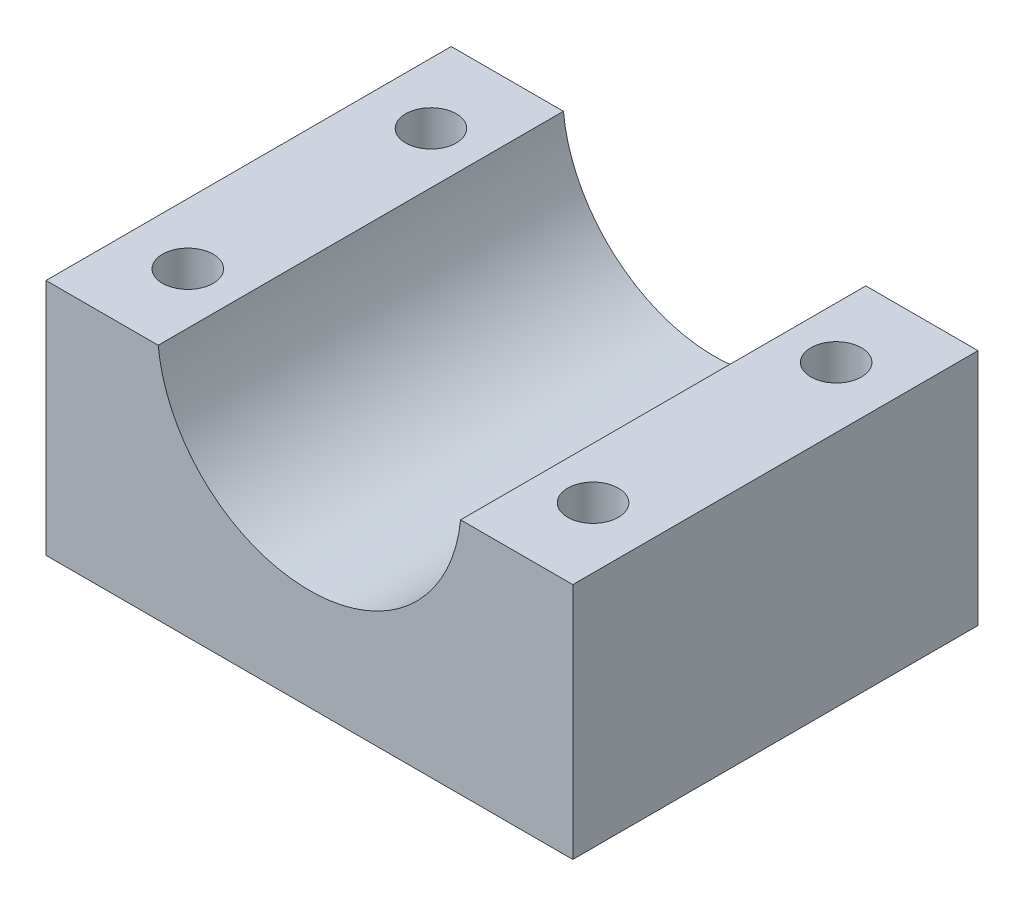
ISO-10303-21;
HEADER;
FILE_DESCRIPTION(('STEP AP214'),'2;1');
FILE_NAME('part.step','',(''),(''),'','','');
FILE_SCHEMA(('AUTOMOTIVE_DESIGN { 1 0 10303 214 1 1 1 1 }'));
ENDSEC;
DATA;
#1=APPLICATION_CONTEXT('core data for automotive mechanical design processes');
#2=APPLICATION_PROTOCOL_DEFINITION('international standard','automotive_design',2000,#1);
#3=PRODUCT_CONTEXT('',#1,'mechanical');
#4=PRODUCT('Part','Part','',(#3));
#5=PRODUCT_RELATED_PRODUCT_CATEGORY('part','',(#4));
#6=PRODUCT_DEFINITION_FORMATION('','',#4);
#7=PRODUCT_DEFINITION_CONTEXT('part definition',#1,'design');
#8=PRODUCT_DEFINITION('design','',#6,#7);
#9=PRODUCT_DEFINITION_SHAPE('','',#8);
#10=(LENGTH_UNIT() NAMED_UNIT(*) SI_UNIT(.MILLI.,.METRE.));
#11=(NAMED_UNIT(*) PLANE_ANGLE_UNIT() SI_UNIT($,.RADIAN.));
#12=(NAMED_UNIT(*) SI_UNIT($,.STERADIAN.) SOLID_ANGLE_UNIT());
#13=UNCERTAINTY_MEASURE_WITH_UNIT(LENGTH_MEASURE(1.E-05),#10,'distance_accuracy_value','');
#14=(GEOMETRIC_REPRESENTATION_CONTEXT(3) GLOBAL_UNCERTAINTY_ASSIGNED_CONTEXT((#13)) GLOBAL_UNIT_ASSIGNED_CONTEXT((#10,
#11,#12)) REPRESENTATION_CONTEXT('',''));
#15=CARTESIAN_POINT('',(0.,0.,0.));
#16=DIRECTION('',(0.,0.,1.));
#17=DIRECTION('',(1.,0.,0.));
#18=AXIS2_PLACEMENT_3D('',#15,#16,#17);
#19=CARTESIAN_POINT('',(26.,25.,40.));
#20=DIRECTION('',(0.,0.,-1.));
#21=DIRECTION('',(-1.,0.,0.));
#22=AXIS2_PLACEMENT_3D('',#19,#20,#21);
#23=CYLINDRICAL_SURFACE('',#22,15.);
#24=CARTESIAN_POINT('',(26.,25.,0.));
#25=DIRECTION('',(0.,0.,1.));
#26=DIRECTION('',(1.,0.,0.));
#27=AXIS2_PLACEMENT_3D('',#24,#25,#26);
#28=CIRCLE('',#27,15.);
#29=CARTESIAN_POINT('',(11.0751884434007,23.5,0.));
#30=VERTEX_POINT('',#29);
#31=CARTESIAN_POINT('',(40.9248115565993,23.5,0.));
#32=VERTEX_POINT('',#31);
#33=EDGE_CURVE('E117',#30,#32,#28,.T.);
#34=ORIENTED_EDGE('',*,*,#33,.F.);
#35=DIRECTION('',(0.,0.,-1.));
#36=VECTOR('',#35,1.);
#37=CARTESIAN_POINT('',(11.0751884434007,23.5,40.));
#38=LINE('',#37,#36);
#39=CARTESIAN_POINT('',(11.0751884434007,23.5,40.));
#40=VERTEX_POINT('',#39);
#41=EDGE_CURVE('E11',#40,#30,#38,.T.);
#42=ORIENTED_EDGE('',*,*,#41,.F.);
#43=CARTESIAN_POINT('',(26.,25.,40.));
#44=DIRECTION('',(0.,0.,1.));
#45=DIRECTION('',(1.,0.,0.));
#46=AXIS2_PLACEMENT_3D('',#43,#44,#45);
#47=CIRCLE('',#46,15.);
#48=CARTESIAN_POINT('',(40.9248115565993,23.5,40.));
#49=VERTEX_POINT('',#48);
#50=EDGE_CURVE('E142',#40,#49,#47,.T.);
#51=ORIENTED_EDGE('',*,*,#50,.T.);
#52=DIRECTION('',(0.,0.,-1.));
#53=VECTOR('',#52,1.);
#54=CARTESIAN_POINT('',(40.9248115565993,23.5,40.));
#55=LINE('',#54,#53);
#56=EDGE_CURVE('E51',#49,#32,#55,.T.);
#57=ORIENTED_EDGE('',*,*,#56,.T.);
#58=EDGE_LOOP('',(#34,#42,#51,#57));
#59=FACE_BOUND('',#58,.T.);
#60=ADVANCED_FACE('F35',(#59),#23,.F.);
#61=CARTESIAN_POINT('',(0.,23.5,40.));
#62=DIRECTION('',(0.,1.,0.));
#63=DIRECTION('',(0.,0.,1.));
#64=AXIS2_PLACEMENT_3D('',#61,#62,#63);
#65=PLANE('',#64);
#66=CARTESIAN_POINT('',(6.,23.5,32.));
#67=DIRECTION('',(0.,1.,0.));
#68=DIRECTION('',(0.,0.,1.));
#69=AXIS2_PLACEMENT_3D('',#66,#67,#68);
#70=CIRCLE('',#69,2.5);
#71=CARTESIAN_POINT('',(6.,23.5,29.5));
#72=VERTEX_POINT('',#71);
#73=EDGE_CURVE('E150',#72,#72,#70,.F.);
#74=ORIENTED_EDGE('',*,*,#73,.T.);
#75=EDGE_LOOP('',(#74));
#76=FACE_BOUND('',#75,.T.);
#77=CARTESIAN_POINT('',(6.,23.5,8.));
#78=DIRECTION('',(0.,1.,0.));
#79=DIRECTION('',(0.,0.,1.));
#80=AXIS2_PLACEMENT_3D('',#77,#78,#79);
#81=CIRCLE('',#80,2.5);
#82=CARTESIAN_POINT('',(6.,23.5,5.5));
#83=VERTEX_POINT('',#82);
#84=EDGE_CURVE('E120',#83,#83,#81,.F.);
#85=ORIENTED_EDGE('',*,*,#84,.T.);
#86=EDGE_LOOP('',(#85));
#87=FACE_BOUND('',#86,.T.);
#88=DIRECTION('',(1.,0.,0.));
#89=VECTOR('',#88,1.);
#90=CARTESIAN_POINT('',(0.,23.5,0.));
#91=LINE('',#90,#89);
#92=CARTESIAN_POINT('',(0.,23.5,0.));
#93=VERTEX_POINT('',#92);
#94=EDGE_CURVE('E119',#93,#30,#91,.T.);
#95=ORIENTED_EDGE('',*,*,#94,.F.);
#96=DIRECTION('',(0.,0.,-1.));
#97=VECTOR('',#96,1.);
#98=CARTESIAN_POINT('',(0.,23.5,40.));
#99=LINE('',#98,#97);
#100=CARTESIAN_POINT('',(0.,23.5,40.));
#101=VERTEX_POINT('',#100);
#102=EDGE_CURVE('E43',#101,#93,#99,.T.);
#103=ORIENTED_EDGE('',*,*,#102,.F.);
#104=DIRECTION('',(1.,0.,0.));
#105=VECTOR('',#104,1.);
#106=CARTESIAN_POINT('',(0.,23.5,40.));
#107=LINE('',#106,#105);
#108=EDGE_CURVE('E114',#101,#40,#107,.T.);
#109=ORIENTED_EDGE('',*,*,#108,.T.);
#110=ORIENTED_EDGE('',*,*,#41,.T.);
#111=EDGE_LOOP('',(#95,#103,#109,#110));
#112=FACE_BOUND('',#111,.T.);
#113=ADVANCED_FACE('F138',(#76,#87,#112),#65,.T.);
#114=CARTESIAN_POINT('',(0.,0.,40.));
#115=DIRECTION('',(-1.,0.,0.));
#116=DIRECTION('',(0.,0.,1.));
#117=AXIS2_PLACEMENT_3D('',#114,#115,#116);
#118=PLANE('',#117);
#119=DIRECTION('',(0.,1.,0.));
#120=VECTOR('',#119,1.);
#121=CARTESIAN_POINT('',(0.,0.,0.));
#122=LINE('',#121,#120);
#123=CARTESIAN_POINT('',(0.,0.,0.));
#124=VERTEX_POINT('',#123);
#125=EDGE_CURVE('E123',#124,#93,#122,.T.);
#126=ORIENTED_EDGE('',*,*,#125,.F.);
#127=DIRECTION('',(0.,0.,-1.));
#128=VECTOR('',#127,1.);
#129=CARTESIAN_POINT('',(0.,0.,40.));
#130=LINE('',#129,#128);
#131=CARTESIAN_POINT('',(0.,0.,40.));
#132=VERTEX_POINT('',#131);
#133=EDGE_CURVE('E108',#132,#124,#130,.T.);
#134=ORIENTED_EDGE('',*,*,#133,.F.);
#135=DIRECTION('',(0.,1.,0.));
#136=VECTOR('',#135,1.);
#137=CARTESIAN_POINT('',(0.,0.,40.));
#138=LINE('',#137,#136);
#139=EDGE_CURVE('E98',#132,#101,#138,.T.);
#140=ORIENTED_EDGE('',*,*,#139,.T.);
#141=ORIENTED_EDGE('',*,*,#102,.T.);
#142=EDGE_LOOP('',(#126,#134,#140,#141));
#143=FACE_BOUND('',#142,.T.);
#144=ADVANCED_FACE('F135',(#143),#118,.T.);
#145=CARTESIAN_POINT('',(0.,0.,40.));
#146=DIRECTION('',(0.,1.,0.));
#147=DIRECTION('',(0.,0.,1.));
#148=AXIS2_PLACEMENT_3D('',#145,#146,#147);
#149=PLANE('',#148);
#150=CARTESIAN_POINT('',(46.,0.,8.));
#151=DIRECTION('',(0.,-1.,0.));
#152=DIRECTION('',(0.,0.,-1.));
#153=AXIS2_PLACEMENT_3D('',#150,#151,#152);
#154=CIRCLE('',#153,2.5);
#155=CARTESIAN_POINT('',(46.,0.,5.5));
#156=VERTEX_POINT('',#155);
#157=EDGE_CURVE('E165',#156,#156,#154,.T.);
#158=ORIENTED_EDGE('',*,*,#157,.F.);
#159=EDGE_LOOP('',(#158));
#160=FACE_BOUND('',#159,.T.);
#161=CARTESIAN_POINT('',(46.,0.,32.));
#162=DIRECTION('',(0.,-1.,0.));
#163=DIRECTION('',(0.,0.,-1.));
#164=AXIS2_PLACEMENT_3D('',#161,#162,#163);
#165=CIRCLE('',#164,2.5);
#166=CARTESIAN_POINT('',(46.,0.,29.5));
#167=VERTEX_POINT('',#166);
#168=EDGE_CURVE('E159',#167,#167,#165,.T.);
#169=ORIENTED_EDGE('',*,*,#168,.F.);
#170=EDGE_LOOP('',(#169));
#171=FACE_BOUND('',#170,.T.);
#172=CARTESIAN_POINT('',(6.,0.,32.));
#173=DIRECTION('',(0.,-1.,0.));
#174=DIRECTION('',(0.,0.,-1.));
#175=AXIS2_PLACEMENT_3D('',#172,#173,#174);
#176=CIRCLE('',#175,2.5);
#177=CARTESIAN_POINT('',(6.,0.,29.5));
#178=VERTEX_POINT('',#177);
#179=EDGE_CURVE('E153',#178,#178,#176,.T.);
#180=ORIENTED_EDGE('',*,*,#179,.F.);
#181=EDGE_LOOP('',(#180));
#182=FACE_BOUND('',#181,.T.);
#183=CARTESIAN_POINT('',(6.,0.,8.));
#184=DIRECTION('',(0.,-1.,0.));
#185=DIRECTION('',(0.,0.,-1.));
#186=AXIS2_PLACEMENT_3D('',#183,#184,#185);
#187=CIRCLE('',#186,2.5);
#188=CARTESIAN_POINT('',(6.,0.,5.5));
#189=VERTEX_POINT('',#188);
#190=EDGE_CURVE('E147',#189,#189,#187,.T.);
#191=ORIENTED_EDGE('',*,*,#190,.F.);
#192=EDGE_LOOP('',(#191));
#193=FACE_BOUND('',#192,.T.);
#194=DIRECTION('',(1.,0.,0.));
#195=VECTOR('',#194,1.);
#196=CARTESIAN_POINT('',(0.,0.,0.));
#197=LINE('',#196,#195);
#198=CARTESIAN_POINT('',(52.,0.,0.));
#199=VERTEX_POINT('',#198);
#200=EDGE_CURVE('E105',#124,#199,#197,.T.);
#201=ORIENTED_EDGE('',*,*,#200,.T.);
#202=DIRECTION('',(0.,0.,-1.));
#203=VECTOR('',#202,1.);
#204=CARTESIAN_POINT('',(52.,0.,40.));
#205=LINE('',#204,#203);
#206=CARTESIAN_POINT('',(52.,0.,40.));
#207=VERTEX_POINT('',#206);
#208=EDGE_CURVE('E102',#207,#199,#205,.T.);
#209=ORIENTED_EDGE('',*,*,#208,.F.);
#210=DIRECTION('',(1.,0.,0.));
#211=VECTOR('',#210,1.);
#212=CARTESIAN_POINT('',(0.,0.,40.));
#213=LINE('',#212,#211);
#214=EDGE_CURVE('E90',#132,#207,#213,.T.);
#215=ORIENTED_EDGE('',*,*,#214,.F.);
#216=ORIENTED_EDGE('',*,*,#133,.T.);
#217=EDGE_LOOP('',(#201,#209,#215,#216));
#218=FACE_BOUND('',#217,.T.);
#219=ADVANCED_FACE('F103',(#160,#171,#182,#193,#218),#149,.F.);
#220=CARTESIAN_POINT('',(52.,0.,40.));
#221=DIRECTION('',(-1.,0.,0.));
#222=DIRECTION('',(0.,0.,1.));
#223=AXIS2_PLACEMENT_3D('',#220,#221,#222);
#224=PLANE('',#223);
#225=DIRECTION('',(0.,1.,0.));
#226=VECTOR('',#225,1.);
#227=CARTESIAN_POINT('',(52.,0.,0.));
#228=LINE('',#227,#226);
#229=CARTESIAN_POINT('',(52.,23.5,0.));
#230=VERTEX_POINT('',#229);
#231=EDGE_CURVE('E128',#199,#230,#228,.T.);
#232=ORIENTED_EDGE('',*,*,#231,.T.);
#233=DIRECTION('',(0.,0.,-1.));
#234=VECTOR('',#233,1.);
#235=CARTESIAN_POINT('',(52.,23.5,40.));
#236=LINE('',#235,#234);
#237=CARTESIAN_POINT('',(52.,23.5,40.));
#238=VERTEX_POINT('',#237);
#239=EDGE_CURVE('E71',#238,#230,#236,.T.);
#240=ORIENTED_EDGE('',*,*,#239,.F.);
#241=DIRECTION('',(0.,1.,0.));
#242=VECTOR('',#241,1.);
#243=CARTESIAN_POINT('',(52.,0.,40.));
#244=LINE('',#243,#242);
#245=EDGE_CURVE('E95',#207,#238,#244,.T.);
#246=ORIENTED_EDGE('',*,*,#245,.F.);
#247=ORIENTED_EDGE('',*,*,#208,.T.);
#248=EDGE_LOOP('',(#232,#240,#246,#247));
#249=FACE_BOUND('',#248,.T.);
#250=ADVANCED_FACE('F110',(#249),#224,.F.);
#251=CARTESIAN_POINT('',(46.,23.5,8.));
#252=DIRECTION('',(0.,1.,0.));
#253=DIRECTION('',(0.,0.,1.));
#254=AXIS2_PLACEMENT_3D('',#251,#252,#253);
#255=CIRCLE('',#254,2.5);
#256=CARTESIAN_POINT('',(46.,23.5,5.5));
#257=VERTEX_POINT('',#256);
#258=EDGE_CURVE('E162',#257,#257,#255,.F.);
#259=ORIENTED_EDGE('',*,*,#258,.T.);
#260=EDGE_LOOP('',(#259));
#261=FACE_BOUND('',#260,.T.);
#262=CARTESIAN_POINT('',(46.,23.5,32.));
#263=DIRECTION('',(0.,1.,0.));
#264=DIRECTION('',(0.,0.,1.));
#265=AXIS2_PLACEMENT_3D('',#262,#263,#264);
#266=CIRCLE('',#265,2.5);
#267=CARTESIAN_POINT('',(46.,23.5,29.5));
#268=VERTEX_POINT('',#267);
#269=EDGE_CURVE('E156',#268,#268,#266,.F.);
#270=ORIENTED_EDGE('',*,*,#269,.T.);
#271=EDGE_LOOP('',(#270));
#272=FACE_BOUND('',#271,.T.);
#273=EDGE_CURVE('E124',#32,#230,#91,.T.);
#274=ORIENTED_EDGE('',*,*,#273,.F.);
#275=ORIENTED_EDGE('',*,*,#56,.F.);
#276=EDGE_CURVE('E111',#49,#238,#107,.T.);
#277=ORIENTED_EDGE('',*,*,#276,.T.);
#278=ORIENTED_EDGE('',*,*,#239,.T.);
#279=EDGE_LOOP('',(#274,#275,#277,#278));
#280=FACE_BOUND('',#279,.T.);
#281=ADVANCED_FACE('F191',(#261,#272,#280),#65,.T.);
#282=CARTESIAN_POINT('',(0.,0.,40.));
#283=DIRECTION('',(0.,0.,1.));
#284=DIRECTION('',(1.,0.,0.));
#285=AXIS2_PLACEMENT_3D('',#282,#283,#284);
#286=PLANE('',#285);
#287=ORIENTED_EDGE('',*,*,#50,.F.);
#288=ORIENTED_EDGE('',*,*,#108,.F.);
#289=ORIENTED_EDGE('',*,*,#139,.F.);
#290=ORIENTED_EDGE('',*,*,#214,.T.);
#291=ORIENTED_EDGE('',*,*,#245,.T.);
#292=ORIENTED_EDGE('',*,*,#276,.F.);
#293=EDGE_LOOP('',(#287,#288,#289,#290,#291,#292));
#294=FACE_BOUND('',#293,.T.);
#295=ADVANCED_FACE('F92',(#294),#286,.T.);
#296=CARTESIAN_POINT('',(0.,0.,0.));
#297=DIRECTION('',(0.,0.,1.));
#298=DIRECTION('',(1.,0.,0.));
#299=AXIS2_PLACEMENT_3D('',#296,#297,#298);
#300=PLANE('',#299);
#301=ORIENTED_EDGE('',*,*,#33,.T.);
#302=ORIENTED_EDGE('',*,*,#273,.T.);
#303=ORIENTED_EDGE('',*,*,#231,.F.);
#304=ORIENTED_EDGE('',*,*,#200,.F.);
#305=ORIENTED_EDGE('',*,*,#125,.T.);
#306=ORIENTED_EDGE('',*,*,#94,.T.);
#307=EDGE_LOOP('',(#301,#302,#303,#304,#305,#306));
#308=FACE_BOUND('',#307,.T.);
#309=ADVANCED_FACE('F140',(#308),#300,.F.);
#310=CARTESIAN_POINT('',(6.,30.5710678118655,8.));
#311=DIRECTION('',(0.,-1.,0.));
#312=DIRECTION('',(0.,0.,-1.));
#313=AXIS2_PLACEMENT_3D('',#310,#311,#312);
#314=CYLINDRICAL_SURFACE('',#313,2.5);
#315=CARTESIAN_POINT('',(6.,0.,5.5));
#316=CARTESIAN_POINT('',(6.,0.24479166666667,5.5));
#317=CARTESIAN_POINT('',(6.,0.489583333333336,5.5));
#318=CARTESIAN_POINT('',(6.,0.97916666666667,5.5));
#319=CARTESIAN_POINT('',(6.,1.22395833333334,5.5));
#320=CARTESIAN_POINT('',(6.,1.71354166666667,5.5));
#321=CARTESIAN_POINT('',(6.,1.95833333333334,5.5));
#322=CARTESIAN_POINT('',(6.,2.44791666666667,5.5));
#323=CARTESIAN_POINT('',(6.,2.69270833333334,5.5));
#324=CARTESIAN_POINT('',(6.,3.18229166666667,5.5));
#325=CARTESIAN_POINT('',(6.,3.42708333333334,5.5));
#326=CARTESIAN_POINT('',(6.,3.91666666666667,5.5));
#327=CARTESIAN_POINT('',(6.,4.16145833333334,5.5));
#328=CARTESIAN_POINT('',(6.,4.65104166666667,5.5));
#329=CARTESIAN_POINT('',(6.,4.89583333333334,5.5));
#330=CARTESIAN_POINT('',(6.,5.38541666666667,5.5));
#331=CARTESIAN_POINT('',(6.,5.63020833333333,5.5));
#332=CARTESIAN_POINT('',(6.,6.11979166666667,5.5));
#333=CARTESIAN_POINT('',(6.,6.36458333333334,5.5));
#334=CARTESIAN_POINT('',(6.,6.85416666666667,5.5));
#335=CARTESIAN_POINT('',(6.,7.09895833333334,5.5));
#336=CARTESIAN_POINT('',(6.,7.58854166666667,5.5));
#337=CARTESIAN_POINT('',(6.,7.83333333333334,5.5));
#338=CARTESIAN_POINT('',(6.,8.32291666666667,5.5));
#339=CARTESIAN_POINT('',(6.,8.56770833333334,5.5));
#340=CARTESIAN_POINT('',(6.,9.05729166666667,5.5));
#341=CARTESIAN_POINT('',(6.,9.30208333333333,5.5));
#342=CARTESIAN_POINT('',(6.,9.79166666666667,5.5));
#343=CARTESIAN_POINT('',(6.,10.0364583333333,5.5));
#344=CARTESIAN_POINT('',(6.,10.5260416666667,5.5));
#345=CARTESIAN_POINT('',(6.,10.7708333333333,5.5));
#346=CARTESIAN_POINT('',(6.,11.2604166666667,5.5));
#347=CARTESIAN_POINT('',(6.,11.5052083333333,5.5));
#348=CARTESIAN_POINT('',(6.,11.9947916666667,5.5));
#349=CARTESIAN_POINT('',(6.,12.2395833333333,5.5));
#350=CARTESIAN_POINT('',(6.,12.7291666666667,5.5));
#351=CARTESIAN_POINT('',(6.,12.9739583333333,5.5));
#352=CARTESIAN_POINT('',(6.,13.4635416666667,5.5));
#353=CARTESIAN_POINT('',(6.,13.7083333333333,5.5));
#354=CARTESIAN_POINT('',(6.,14.1979166666667,5.5));
#355=CARTESIAN_POINT('',(6.,14.4427083333333,5.5));
#356=CARTESIAN_POINT('',(6.,14.9322916666667,5.5));
#357=CARTESIAN_POINT('',(6.,15.1770833333333,5.5));
#358=CARTESIAN_POINT('',(6.,15.6666666666667,5.5));
#359=CARTESIAN_POINT('',(6.,15.9114583333333,5.5));
#360=CARTESIAN_POINT('',(6.,16.4010416666667,5.5));
#361=CARTESIAN_POINT('',(6.,16.6458333333333,5.5));
#362=CARTESIAN_POINT('',(6.,17.1354166666667,5.5));
#363=CARTESIAN_POINT('',(6.,17.3802083333333,5.5));
#364=CARTESIAN_POINT('',(6.,17.8697916666667,5.5));
#365=CARTESIAN_POINT('',(6.,18.1145833333333,5.5));
#366=CARTESIAN_POINT('',(6.,18.6041666666667,5.5));
#367=CARTESIAN_POINT('',(6.,18.8489583333333,5.5));
#368=CARTESIAN_POINT('',(6.,19.3385416666667,5.5));
#369=CARTESIAN_POINT('',(6.,19.5833333333333,5.5));
#370=CARTESIAN_POINT('',(6.,20.0729166666667,5.5));
#371=CARTESIAN_POINT('',(6.,20.3177083333333,5.5));
#372=CARTESIAN_POINT('',(6.,20.8072916666667,5.5));
#373=CARTESIAN_POINT('',(6.,21.0520833333333,5.5));
#374=CARTESIAN_POINT('',(6.,21.5416666666667,5.5));
#375=CARTESIAN_POINT('',(6.,21.7864583333333,5.5));
#376=CARTESIAN_POINT('',(6.,22.2760416666667,5.5));
#377=CARTESIAN_POINT('',(6.,22.5208333333333,5.5));
#378=CARTESIAN_POINT('',(6.,23.0104166666667,5.5));
#379=CARTESIAN_POINT('',(6.,23.2552083333333,5.5));
#380=CARTESIAN_POINT('',(6.,23.5,5.5));
#381=B_SPLINE_CURVE_WITH_KNOTS('',3,(#315,#316,#317,#318,#319,#320,#321,#322,#323,#324,#325,
#326,#327,#328,#329,#330,#331,#332,#333,#334,#335,#336,#337,#338,#339,#340,#341,#342,#343,#344,
#345,#346,#347,#348,#349,#350,#351,#352,#353,#354,#355,#356,#357,#358,#359,#360,#361,#362,#363,
#364,#365,#366,#367,#368,#369,#370,#371,#372,#373,#374,#375,#376,#377,#378,#379,#380),
.UNSPECIFIED.,.F.,.F.,(4,2,2,2,2,2,2,2,2,2,2,2,2,2,2,2,2,2,2,2,2,2,2,2,2,2,2,2,2,2,2,2,4),(0.,
0.734374999999999,1.46875,2.203125,2.9375,3.671875,4.40625,5.140625,5.875,6.609375,7.34375,
8.078125,8.8125,9.546875,10.28125,11.015625,11.75,12.484375,13.21875,13.953125,14.6875,
15.421875,16.15625,16.890625,17.625,18.359375,19.09375,19.828125,20.5625,21.296875,22.03125,
22.765625,23.5),.UNSPECIFIED.);
#382=EDGE_CURVE('BSEAM181',#189,#83,#381,.T.);
#383=ORIENTED_EDGE('',*,*,#190,.T.);
#384=ORIENTED_EDGE('',*,*,#84,.F.);
#385=ORIENTED_EDGE('',*,*,#382,.T.);
#386=ORIENTED_EDGE('',*,*,#382,.F.);
#387=EDGE_LOOP('',(#383,#385,#384,#386));
#388=FACE_BOUND('',#387,.T.);
#389=ADVANCED_FACE('F181',(#388),#314,.F.);
#390=CARTESIAN_POINT('',(6.,30.5710678118655,32.));
#391=DIRECTION('',(0.,-1.,0.));
#392=DIRECTION('',(0.,0.,-1.));
#393=AXIS2_PLACEMENT_3D('',#390,#391,#392);
#394=CYLINDRICAL_SURFACE('',#393,2.5);
#395=CARTESIAN_POINT('',(6.,0.,29.5));
#396=CARTESIAN_POINT('',(6.,0.24479166666667,29.5));
#397=CARTESIAN_POINT('',(6.,0.489583333333336,29.5));
#398=CARTESIAN_POINT('',(6.,0.97916666666667,29.5));
#399=CARTESIAN_POINT('',(6.,1.22395833333334,29.5));
#400=CARTESIAN_POINT('',(6.,1.71354166666667,29.5));
#401=CARTESIAN_POINT('',(6.,1.95833333333334,29.5));
#402=CARTESIAN_POINT('',(6.,2.44791666666667,29.5));
#403=CARTESIAN_POINT('',(6.,2.69270833333334,29.5));
#404=CARTESIAN_POINT('',(6.,3.18229166666667,29.5));
#405=CARTESIAN_POINT('',(6.,3.42708333333334,29.5));
#406=CARTESIAN_POINT('',(6.,3.91666666666667,29.5));
#407=CARTESIAN_POINT('',(6.,4.16145833333334,29.5));
#408=CARTESIAN_POINT('',(6.,4.65104166666667,29.5));
#409=CARTESIAN_POINT('',(6.,4.89583333333334,29.5));
#410=CARTESIAN_POINT('',(6.,5.38541666666667,29.5));
#411=CARTESIAN_POINT('',(6.,5.63020833333333,29.5));
#412=CARTESIAN_POINT('',(6.,6.11979166666667,29.5));
#413=CARTESIAN_POINT('',(6.,6.36458333333334,29.5));
#414=CARTESIAN_POINT('',(6.,6.85416666666667,29.5));
#415=CARTESIAN_POINT('',(6.,7.09895833333334,29.5));
#416=CARTESIAN_POINT('',(6.,7.58854166666667,29.5));
#417=CARTESIAN_POINT('',(6.,7.83333333333334,29.5));
#418=CARTESIAN_POINT('',(6.,8.32291666666667,29.5));
#419=CARTESIAN_POINT('',(6.,8.56770833333334,29.5));
#420=CARTESIAN_POINT('',(6.,9.05729166666667,29.5));
#421=CARTESIAN_POINT('',(6.,9.30208333333333,29.5));
#422=CARTESIAN_POINT('',(6.,9.79166666666667,29.5));
#423=CARTESIAN_POINT('',(6.,10.0364583333333,29.5));
#424=CARTESIAN_POINT('',(6.,10.5260416666667,29.5));
#425=CARTESIAN_POINT('',(6.,10.7708333333333,29.5));
#426=CARTESIAN_POINT('',(6.,11.2604166666667,29.5));
#427=CARTESIAN_POINT('',(6.,11.5052083333333,29.5));
#428=CARTESIAN_POINT('',(6.,11.9947916666667,29.5));
#429=CARTESIAN_POINT('',(6.,12.2395833333333,29.5));
#430=CARTESIAN_POINT('',(6.,12.7291666666667,29.5));
#431=CARTESIAN_POINT('',(6.,12.9739583333333,29.5));
#432=CARTESIAN_POINT('',(6.,13.4635416666667,29.5));
#433=CARTESIAN_POINT('',(6.,13.7083333333333,29.5));
#434=CARTESIAN_POINT('',(6.,14.1979166666667,29.5));
#435=CARTESIAN_POINT('',(6.,14.4427083333333,29.5));
#436=CARTESIAN_POINT('',(6.,14.9322916666667,29.5));
#437=CARTESIAN_POINT('',(6.,15.1770833333333,29.5));
#438=CARTESIAN_POINT('',(6.,15.6666666666667,29.5));
#439=CARTESIAN_POINT('',(6.,15.9114583333333,29.5));
#440=CARTESIAN_POINT('',(6.,16.4010416666667,29.5));
#441=CARTESIAN_POINT('',(6.,16.6458333333333,29.5));
#442=CARTESIAN_POINT('',(6.,17.1354166666667,29.5));
#443=CARTESIAN_POINT('',(6.,17.3802083333333,29.5));
#444=CARTESIAN_POINT('',(6.,17.8697916666667,29.5));
#445=CARTESIAN_POINT('',(6.,18.1145833333333,29.5));
#446=CARTESIAN_POINT('',(6.,18.6041666666667,29.5));
#447=CARTESIAN_POINT('',(6.,18.8489583333333,29.5));
#448=CARTESIAN_POINT('',(6.,19.3385416666667,29.5));
#449=CARTESIAN_POINT('',(6.,19.5833333333333,29.5));
#450=CARTESIAN_POINT('',(6.,20.0729166666667,29.5));
#451=CARTESIAN_POINT('',(6.,20.3177083333333,29.5));
#452=CARTESIAN_POINT('',(6.,20.8072916666667,29.5));
#453=CARTESIAN_POINT('',(6.,21.0520833333333,29.5));
#454=CARTESIAN_POINT('',(6.,21.5416666666667,29.5));
#455=CARTESIAN_POINT('',(6.,21.7864583333333,29.5));
#456=CARTESIAN_POINT('',(6.,22.2760416666667,29.5));
#457=CARTESIAN_POINT('',(6.,22.5208333333333,29.5));
#458=CARTESIAN_POINT('',(6.,23.0104166666667,29.5));
#459=CARTESIAN_POINT('',(6.,23.2552083333333,29.5));
#460=CARTESIAN_POINT('',(6.,23.5,29.5));
#461=B_SPLINE_CURVE_WITH_KNOTS('',3,(#395,#396,#397,#398,#399,#400,#401,#402,#403,#404,#405,
#406,#407,#408,#409,#410,#411,#412,#413,#414,#415,#416,#417,#418,#419,#420,#421,#422,#423,#424,
#425,#426,#427,#428,#429,#430,#431,#432,#433,#434,#435,#436,#437,#438,#439,#440,#441,#442,#443,
#444,#445,#446,#447,#448,#449,#450,#451,#452,#453,#454,#455,#456,#457,#458,#459,#460),
.UNSPECIFIED.,.F.,.F.,(4,2,2,2,2,2,2,2,2,2,2,2,2,2,2,2,2,2,2,2,2,2,2,2,2,2,2,2,2,2,2,2,4),(0.,
0.734374999999999,1.46875,2.203125,2.9375,3.671875,4.40625,5.140625,5.875,6.609375,7.34375,
8.078125,8.8125,9.546875,10.28125,11.015625,11.75,12.484375,13.21875,13.953125,14.6875,
15.421875,16.15625,16.890625,17.625,18.359375,19.09375,19.828125,20.5625,21.296875,22.03125,
22.765625,23.5),.UNSPECIFIED.);
#462=EDGE_CURVE('BSEAM184',#178,#72,#461,.T.);
#463=ORIENTED_EDGE('',*,*,#179,.T.);
#464=ORIENTED_EDGE('',*,*,#73,.F.);
#465=ORIENTED_EDGE('',*,*,#462,.T.);
#466=ORIENTED_EDGE('',*,*,#462,.F.);
#467=EDGE_LOOP('',(#463,#465,#464,#466));
#468=FACE_BOUND('',#467,.T.);
#469=ADVANCED_FACE('F184',(#468),#394,.F.);
#470=CARTESIAN_POINT('',(46.,30.5710678118655,32.));
#471=DIRECTION('',(0.,-1.,0.));
#472=DIRECTION('',(0.,0.,-1.));
#473=AXIS2_PLACEMENT_3D('',#470,#471,#472);
#474=CYLINDRICAL_SURFACE('',#473,2.5);
#475=CARTESIAN_POINT('',(46.,0.,29.5));
#476=CARTESIAN_POINT('',(46.,0.24479166666667,29.5));
#477=CARTESIAN_POINT('',(46.,0.489583333333336,29.5));
#478=CARTESIAN_POINT('',(46.,0.97916666666667,29.5));
#479=CARTESIAN_POINT('',(46.,1.22395833333334,29.5));
#480=CARTESIAN_POINT('',(46.,1.71354166666667,29.5));
#481=CARTESIAN_POINT('',(46.,1.95833333333334,29.5));
#482=CARTESIAN_POINT('',(46.,2.44791666666667,29.5));
#483=CARTESIAN_POINT('',(46.,2.69270833333334,29.5));
#484=CARTESIAN_POINT('',(46.,3.18229166666667,29.5));
#485=CARTESIAN_POINT('',(46.,3.42708333333334,29.5));
#486=CARTESIAN_POINT('',(46.,3.91666666666667,29.5));
#487=CARTESIAN_POINT('',(46.,4.16145833333334,29.5));
#488=CARTESIAN_POINT('',(46.,4.65104166666667,29.5));
#489=CARTESIAN_POINT('',(46.,4.89583333333334,29.5));
#490=CARTESIAN_POINT('',(46.,5.38541666666667,29.5));
#491=CARTESIAN_POINT('',(46.,5.63020833333333,29.5));
#492=CARTESIAN_POINT('',(46.,6.11979166666667,29.5));
#493=CARTESIAN_POINT('',(46.,6.36458333333334,29.5));
#494=CARTESIAN_POINT('',(46.,6.85416666666667,29.5));
#495=CARTESIAN_POINT('',(46.,7.09895833333334,29.5));
#496=CARTESIAN_POINT('',(46.,7.58854166666667,29.5));
#497=CARTESIAN_POINT('',(46.,7.83333333333334,29.5));
#498=CARTESIAN_POINT('',(46.,8.32291666666667,29.5));
#499=CARTESIAN_POINT('',(46.,8.56770833333334,29.5));
#500=CARTESIAN_POINT('',(46.,9.05729166666667,29.5));
#501=CARTESIAN_POINT('',(46.,9.30208333333333,29.5));
#502=CARTESIAN_POINT('',(46.,9.79166666666667,29.5));
#503=CARTESIAN_POINT('',(46.,10.0364583333333,29.5));
#504=CARTESIAN_POINT('',(46.,10.5260416666667,29.5));
#505=CARTESIAN_POINT('',(46.,10.7708333333333,29.5));
#506=CARTESIAN_POINT('',(46.,11.2604166666667,29.5));
#507=CARTESIAN_POINT('',(46.,11.5052083333333,29.5));
#508=CARTESIAN_POINT('',(46.,11.9947916666667,29.5));
#509=CARTESIAN_POINT('',(46.,12.2395833333333,29.5));
#510=CARTESIAN_POINT('',(46.,12.7291666666667,29.5));
#511=CARTESIAN_POINT('',(46.,12.9739583333333,29.5));
#512=CARTESIAN_POINT('',(46.,13.4635416666667,29.5));
#513=CARTESIAN_POINT('',(46.,13.7083333333333,29.5));
#514=CARTESIAN_POINT('',(46.,14.1979166666667,29.5));
#515=CARTESIAN_POINT('',(46.,14.4427083333333,29.5));
#516=CARTESIAN_POINT('',(46.,14.9322916666667,29.5));
#517=CARTESIAN_POINT('',(46.,15.1770833333333,29.5));
#518=CARTESIAN_POINT('',(46.,15.6666666666667,29.5));
#519=CARTESIAN_POINT('',(46.,15.9114583333333,29.5));
#520=CARTESIAN_POINT('',(46.,16.4010416666667,29.5));
#521=CARTESIAN_POINT('',(46.,16.6458333333333,29.5));
#522=CARTESIAN_POINT('',(46.,17.1354166666667,29.5));
#523=CARTESIAN_POINT('',(46.,17.3802083333333,29.5));
#524=CARTESIAN_POINT('',(46.,17.8697916666667,29.5));
#525=CARTESIAN_POINT('',(46.,18.1145833333333,29.5));
#526=CARTESIAN_POINT('',(46.,18.6041666666667,29.5));
#527=CARTESIAN_POINT('',(46.,18.8489583333333,29.5));
#528=CARTESIAN_POINT('',(46.,19.3385416666667,29.5));
#529=CARTESIAN_POINT('',(46.,19.5833333333333,29.5));
#530=CARTESIAN_POINT('',(46.,20.0729166666667,29.5));
#531=CARTESIAN_POINT('',(46.,20.3177083333333,29.5));
#532=CARTESIAN_POINT('',(46.,20.8072916666667,29.5));
#533=CARTESIAN_POINT('',(46.,21.0520833333333,29.5));
#534=CARTESIAN_POINT('',(46.,21.5416666666667,29.5));
#535=CARTESIAN_POINT('',(46.,21.7864583333333,29.5));
#536=CARTESIAN_POINT('',(46.,22.2760416666667,29.5));
#537=CARTESIAN_POINT('',(46.,22.5208333333333,29.5));
#538=CARTESIAN_POINT('',(46.,23.0104166666667,29.5));
#539=CARTESIAN_POINT('',(46.,23.2552083333333,29.5));
#540=CARTESIAN_POINT('',(46.,23.5,29.5));
#541=B_SPLINE_CURVE_WITH_KNOTS('',3,(#475,#476,#477,#478,#479,#480,#481,#482,#483,#484,#485,
#486,#487,#488,#489,#490,#491,#492,#493,#494,#495,#496,#497,#498,#499,#500,#501,#502,#503,#504,
#505,#506,#507,#508,#509,#510,#511,#512,#513,#514,#515,#516,#517,#518,#519,#520,#521,#522,#523,
#524,#525,#526,#527,#528,#529,#530,#531,#532,#533,#534,#535,#536,#537,#538,#539,#540),
.UNSPECIFIED.,.F.,.F.,(4,2,2,2,2,2,2,2,2,2,2,2,2,2,2,2,2,2,2,2,2,2,2,2,2,2,2,2,2,2,2,2,4),(0.,
0.734374999999999,1.46875,2.203125,2.9375,3.671875,4.40625,5.140625,5.875,6.609375,7.34375,
8.078125,8.8125,9.546875,10.28125,11.015625,11.75,12.484375,13.21875,13.953125,14.6875,
15.421875,16.15625,16.890625,17.625,18.359375,19.09375,19.828125,20.5625,21.296875,22.03125,
22.765625,23.5),.UNSPECIFIED.);
#542=EDGE_CURVE('BSEAM209',#167,#268,#541,.T.);
#543=ORIENTED_EDGE('',*,*,#168,.T.);
#544=ORIENTED_EDGE('',*,*,#269,.F.);
#545=ORIENTED_EDGE('',*,*,#542,.T.);
#546=ORIENTED_EDGE('',*,*,#542,.F.);
#547=EDGE_LOOP('',(#543,#545,#544,#546));
#548=FACE_BOUND('',#547,.T.);
#549=ADVANCED_FACE('F209',(#548),#474,.F.);
#550=CARTESIAN_POINT('',(46.,30.5710678118655,8.));
#551=DIRECTION('',(0.,-1.,0.));
#552=DIRECTION('',(0.,0.,-1.));
#553=AXIS2_PLACEMENT_3D('',#550,#551,#552);
#554=CYLINDRICAL_SURFACE('',#553,2.5);
#555=CARTESIAN_POINT('',(46.,0.,5.5));
#556=CARTESIAN_POINT('',(46.,0.24479166666667,5.5));
#557=CARTESIAN_POINT('',(46.,0.489583333333336,5.5));
#558=CARTESIAN_POINT('',(46.,0.97916666666667,5.5));
#559=CARTESIAN_POINT('',(46.,1.22395833333334,5.5));
#560=CARTESIAN_POINT('',(46.,1.71354166666667,5.5));
#561=CARTESIAN_POINT('',(46.,1.95833333333334,5.5));
#562=CARTESIAN_POINT('',(46.,2.44791666666667,5.5));
#563=CARTESIAN_POINT('',(46.,2.69270833333334,5.5));
#564=CARTESIAN_POINT('',(46.,3.18229166666667,5.5));
#565=CARTESIAN_POINT('',(46.,3.42708333333334,5.5));
#566=CARTESIAN_POINT('',(46.,3.91666666666667,5.5));
#567=CARTESIAN_POINT('',(46.,4.16145833333334,5.5));
#568=CARTESIAN_POINT('',(46.,4.65104166666667,5.5));
#569=CARTESIAN_POINT('',(46.,4.89583333333334,5.5));
#570=CARTESIAN_POINT('',(46.,5.38541666666667,5.5));
#571=CARTESIAN_POINT('',(46.,5.63020833333333,5.5));
#572=CARTESIAN_POINT('',(46.,6.11979166666667,5.5));
#573=CARTESIAN_POINT('',(46.,6.36458333333334,5.5));
#574=CARTESIAN_POINT('',(46.,6.85416666666667,5.5));
#575=CARTESIAN_POINT('',(46.,7.09895833333334,5.5));
#576=CARTESIAN_POINT('',(46.,7.58854166666667,5.5));
#577=CARTESIAN_POINT('',(46.,7.83333333333334,5.5));
#578=CARTESIAN_POINT('',(46.,8.32291666666667,5.5));
#579=CARTESIAN_POINT('',(46.,8.56770833333334,5.5));
#580=CARTESIAN_POINT('',(46.,9.05729166666667,5.5));
#581=CARTESIAN_POINT('',(46.,9.30208333333333,5.5));
#582=CARTESIAN_POINT('',(46.,9.79166666666667,5.5));
#583=CARTESIAN_POINT('',(46.,10.0364583333333,5.5));
#584=CARTESIAN_POINT('',(46.,10.5260416666667,5.5));
#585=CARTESIAN_POINT('',(46.,10.7708333333333,5.5));
#586=CARTESIAN_POINT('',(46.,11.2604166666667,5.5));
#587=CARTESIAN_POINT('',(46.,11.5052083333333,5.5));
#588=CARTESIAN_POINT('',(46.,11.9947916666667,5.5));
#589=CARTESIAN_POINT('',(46.,12.2395833333333,5.5));
#590=CARTESIAN_POINT('',(46.,12.7291666666667,5.5));
#591=CARTESIAN_POINT('',(46.,12.9739583333333,5.5));
#592=CARTESIAN_POINT('',(46.,13.4635416666667,5.5));
#593=CARTESIAN_POINT('',(46.,13.7083333333333,5.5));
#594=CARTESIAN_POINT('',(46.,14.1979166666667,5.5));
#595=CARTESIAN_POINT('',(46.,14.4427083333333,5.5));
#596=CARTESIAN_POINT('',(46.,14.9322916666667,5.5));
#597=CARTESIAN_POINT('',(46.,15.1770833333333,5.5));
#598=CARTESIAN_POINT('',(46.,15.6666666666667,5.5));
#599=CARTESIAN_POINT('',(46.,15.9114583333333,5.5));
#600=CARTESIAN_POINT('',(46.,16.4010416666667,5.5));
#601=CARTESIAN_POINT('',(46.,16.6458333333333,5.5));
#602=CARTESIAN_POINT('',(46.,17.1354166666667,5.5));
#603=CARTESIAN_POINT('',(46.,17.3802083333333,5.5));
#604=CARTESIAN_POINT('',(46.,17.8697916666667,5.5));
#605=CARTESIAN_POINT('',(46.,18.1145833333333,5.5));
#606=CARTESIAN_POINT('',(46.,18.6041666666667,5.5));
#607=CARTESIAN_POINT('',(46.,18.8489583333333,5.5));
#608=CARTESIAN_POINT('',(46.,19.3385416666667,5.5));
#609=CARTESIAN_POINT('',(46.,19.5833333333333,5.5));
#610=CARTESIAN_POINT('',(46.,20.0729166666667,5.5));
#611=CARTESIAN_POINT('',(46.,20.3177083333333,5.5));
#612=CARTESIAN_POINT('',(46.,20.8072916666667,5.5));
#613=CARTESIAN_POINT('',(46.,21.0520833333333,5.5));
#614=CARTESIAN_POINT('',(46.,21.5416666666667,5.5));
#615=CARTESIAN_POINT('',(46.,21.7864583333333,5.5));
#616=CARTESIAN_POINT('',(46.,22.2760416666667,5.5));
#617=CARTESIAN_POINT('',(46.,22.5208333333333,5.5));
#618=CARTESIAN_POINT('',(46.,23.0104166666667,5.5));
#619=CARTESIAN_POINT('',(46.,23.2552083333333,5.5));
#620=CARTESIAN_POINT('',(46.,23.5,5.5));
#621=B_SPLINE_CURVE_WITH_KNOTS('',3,(#555,#556,#557,#558,#559,#560,#561,#562,#563,#564,#565,
#566,#567,#568,#569,#570,#571,#572,#573,#574,#575,#576,#577,#578,#579,#580,#581,#582,#583,#584,
#585,#586,#587,#588,#589,#590,#591,#592,#593,#594,#595,#596,#597,#598,#599,#600,#601,#602,#603,
#604,#605,#606,#607,#608,#609,#610,#611,#612,#613,#614,#615,#616,#617,#618,#619,#620),
.UNSPECIFIED.,.F.,.F.,(4,2,2,2,2,2,2,2,2,2,2,2,2,2,2,2,2,2,2,2,2,2,2,2,2,2,2,2,2,2,2,2,4),(0.,
0.734374999999999,1.46875,2.203125,2.9375,3.671875,4.40625,5.140625,5.875,6.609375,7.34375,
8.078125,8.8125,9.546875,10.28125,11.015625,11.75,12.484375,13.21875,13.953125,14.6875,
15.421875,16.15625,16.890625,17.625,18.359375,19.09375,19.828125,20.5625,21.296875,22.03125,
22.765625,23.5),.UNSPECIFIED.);
#622=EDGE_CURVE('BSEAM169',#156,#257,#621,.T.);
#623=ORIENTED_EDGE('',*,*,#157,.T.);
#624=ORIENTED_EDGE('',*,*,#258,.F.);
#625=ORIENTED_EDGE('',*,*,#622,.T.);
#626=ORIENTED_EDGE('',*,*,#622,.F.);
#627=EDGE_LOOP('',(#623,#625,#624,#626));
#628=FACE_BOUND('',#627,.T.);
#629=ADVANCED_FACE('F169',(#628),#554,.F.);
#630=CLOSED_SHELL('',(#60,#113,#144,#219,#250,#281,#295,#309,#389,#469,#549,#629));
#631=MANIFOLD_SOLID_BREP('B2',#630);
#632=ADVANCED_BREP_SHAPE_REPRESENTATION('',(#18,#631),#14);
#633=SHAPE_DEFINITION_REPRESENTATION(#9,#632);
ENDSEC;
END-ISO-10303-21;
